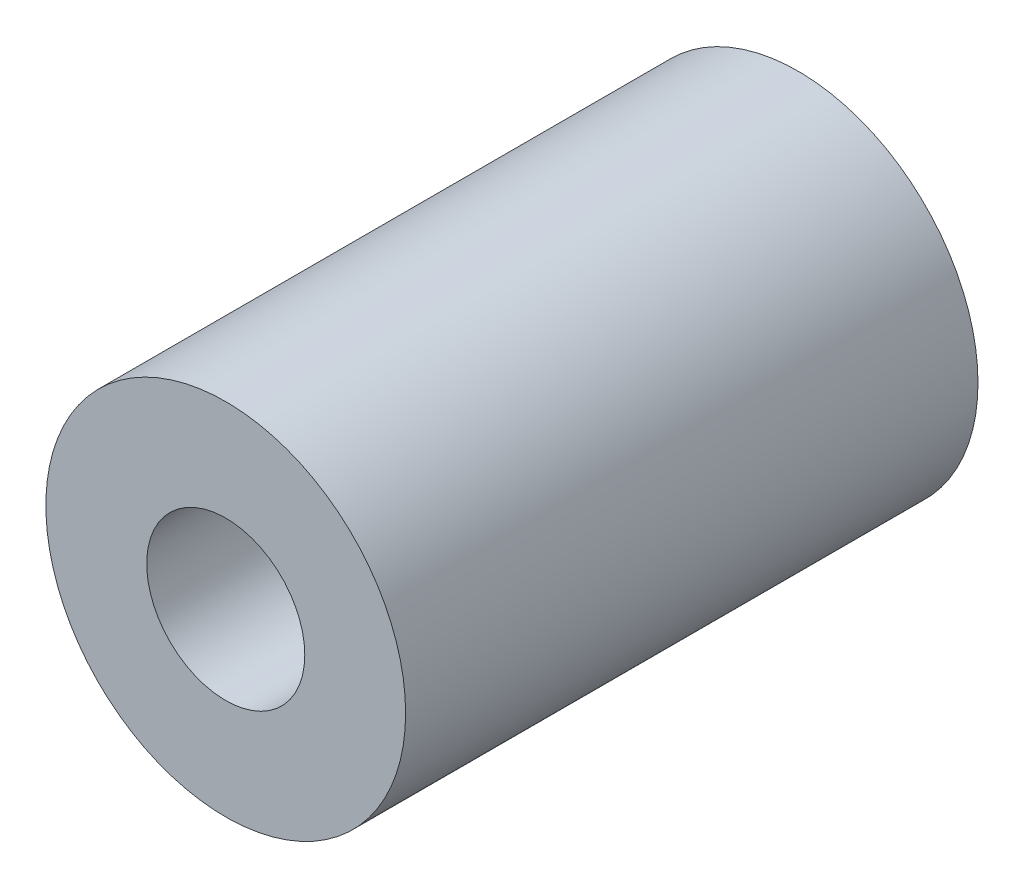
ISO-10303-21;
HEADER;
FILE_DESCRIPTION(('STEP AP214'),'2;1');
FILE_NAME('part.step','',(''),(''),'','','');
FILE_SCHEMA(('AUTOMOTIVE_DESIGN { 1 0 10303 214 1 1 1 1 }'));
ENDSEC;
DATA;
#1=APPLICATION_CONTEXT('core data for automotive mechanical design processes');
#2=APPLICATION_PROTOCOL_DEFINITION('international standard','automotive_design',2000,#1);
#3=PRODUCT_CONTEXT('',#1,'mechanical');
#4=PRODUCT('Part','Part','',(#3));
#5=PRODUCT_RELATED_PRODUCT_CATEGORY('part','',(#4));
#6=PRODUCT_DEFINITION_FORMATION('','',#4);
#7=PRODUCT_DEFINITION_CONTEXT('part definition',#1,'design');
#8=PRODUCT_DEFINITION('design','',#6,#7);
#9=PRODUCT_DEFINITION_SHAPE('','',#8);
#10=(LENGTH_UNIT() NAMED_UNIT(*) SI_UNIT(.MILLI.,.METRE.));
#11=(NAMED_UNIT(*) PLANE_ANGLE_UNIT() SI_UNIT($,.RADIAN.));
#12=(NAMED_UNIT(*) SI_UNIT($,.STERADIAN.) SOLID_ANGLE_UNIT());
#13=UNCERTAINTY_MEASURE_WITH_UNIT(LENGTH_MEASURE(1.E-05),#10,'distance_accuracy_value','');
#14=(GEOMETRIC_REPRESENTATION_CONTEXT(3) GLOBAL_UNCERTAINTY_ASSIGNED_CONTEXT((#13)) GLOBAL_UNIT_ASSIGNED_CONTEXT((#10,
#11,#12)) REPRESENTATION_CONTEXT('',''));
#15=CARTESIAN_POINT('',(0.,0.,0.));
#16=DIRECTION('',(0.,0.,1.));
#17=DIRECTION('',(1.,0.,0.));
#18=AXIS2_PLACEMENT_3D('',#15,#16,#17);
#19=CARTESIAN_POINT('',(0.,0.,52.5));
#20=DIRECTION('',(0.,0.,1.));
#21=DIRECTION('',(1.,0.,0.));
#22=AXIS2_PLACEMENT_3D('',#19,#20,#21);
#23=PLANE('',#22);
#24=CARTESIAN_POINT('',(0.,0.,52.5));
#25=DIRECTION('',(0.,0.,1.));
#26=DIRECTION('',(1.,0.,0.));
#27=AXIS2_PLACEMENT_3D('',#24,#25,#26);
#28=CIRCLE('',#27,33.);
#29=CARTESIAN_POINT('',(33.,0.,52.5));
#30=VERTEX_POINT('',#29);
#31=EDGE_CURVE('E10',#30,#30,#28,.T.);
#32=ORIENTED_EDGE('',*,*,#31,.T.);
#33=EDGE_LOOP('',(#32));
#34=FACE_BOUND('',#33,.T.);
#35=CARTESIAN_POINT('',(0.,0.,52.5));
#36=DIRECTION('',(0.,0.,1.));
#37=DIRECTION('',(1.,0.,0.));
#38=AXIS2_PLACEMENT_3D('',#35,#36,#37);
#39=CIRCLE('',#38,14.5);
#40=CARTESIAN_POINT('',(14.5,0.,52.5));
#41=VERTEX_POINT('',#40);
#42=EDGE_CURVE('E43',#41,#41,#39,.T.);
#43=ORIENTED_EDGE('',*,*,#42,.F.);
#44=EDGE_LOOP('',(#43));
#45=FACE_BOUND('',#44,.T.);
#46=ADVANCED_FACE('F32',(#34,#45),#23,.T.);
#47=CARTESIAN_POINT('',(0.,0.,-52.5));
#48=DIRECTION('',(0.,0.,1.));
#49=DIRECTION('',(1.,0.,0.));
#50=AXIS2_PLACEMENT_3D('',#47,#48,#49);
#51=PLANE('',#50);
#52=CARTESIAN_POINT('',(0.,0.,-52.5));
#53=DIRECTION('',(0.,0.,1.));
#54=DIRECTION('',(1.,0.,0.));
#55=AXIS2_PLACEMENT_3D('',#52,#53,#54);
#56=CIRCLE('',#55,33.);
#57=CARTESIAN_POINT('',(33.,0.,-52.5));
#58=VERTEX_POINT('',#57);
#59=EDGE_CURVE('E36',#58,#58,#56,.T.);
#60=ORIENTED_EDGE('',*,*,#59,.F.);
#61=EDGE_LOOP('',(#60));
#62=FACE_BOUND('',#61,.T.);
#63=CARTESIAN_POINT('',(0.,0.,-52.5));
#64=DIRECTION('',(0.,0.,1.));
#65=DIRECTION('',(1.,0.,0.));
#66=AXIS2_PLACEMENT_3D('',#63,#64,#65);
#67=CIRCLE('',#66,14.5);
#68=CARTESIAN_POINT('',(14.5,0.,-52.5));
#69=VERTEX_POINT('',#68);
#70=EDGE_CURVE('E45',#69,#69,#67,.T.);
#71=ORIENTED_EDGE('',*,*,#70,.T.);
#72=EDGE_LOOP('',(#71));
#73=FACE_BOUND('',#72,.T.);
#74=ADVANCED_FACE('F55',(#62,#73),#51,.F.);
#75=CARTESIAN_POINT('',(0.,0.,52.5));
#76=DIRECTION('',(0.,0.,-1.));
#77=DIRECTION('',(-1.,0.,0.));
#78=AXIS2_PLACEMENT_3D('',#75,#76,#77);
#79=CYLINDRICAL_SURFACE('',#78,33.);
#80=ORIENTED_EDGE('',*,*,#31,.F.);
#81=EDGE_LOOP('',(#80));
#82=FACE_BOUND('',#81,.T.);
#83=ORIENTED_EDGE('',*,*,#59,.T.);
#84=EDGE_LOOP('',(#83));
#85=FACE_BOUND('',#84,.T.);
#86=ADVANCED_FACE('F34',(#82,#85),#79,.T.);
#87=CARTESIAN_POINT('',(0.,0.,52.5));
#88=DIRECTION('',(0.,0.,-1.));
#89=DIRECTION('',(-1.,0.,0.));
#90=AXIS2_PLACEMENT_3D('',#87,#88,#89);
#91=CYLINDRICAL_SURFACE('',#90,14.5);
#92=ORIENTED_EDGE('',*,*,#42,.T.);
#93=EDGE_LOOP('',(#92));
#94=FACE_BOUND('',#93,.T.);
#95=ORIENTED_EDGE('',*,*,#70,.F.);
#96=EDGE_LOOP('',(#95));
#97=FACE_BOUND('',#96,.T.);
#98=ADVANCED_FACE('F51',(#94,#97),#91,.F.);
#99=CLOSED_SHELL('',(#46,#74,#86,#98));
#100=MANIFOLD_SOLID_BREP('B2',#99);
#101=ADVANCED_BREP_SHAPE_REPRESENTATION('',(#18,#100),#14);
#102=SHAPE_DEFINITION_REPRESENTATION(#9,#101);
ENDSEC;
END-ISO-10303-21;
